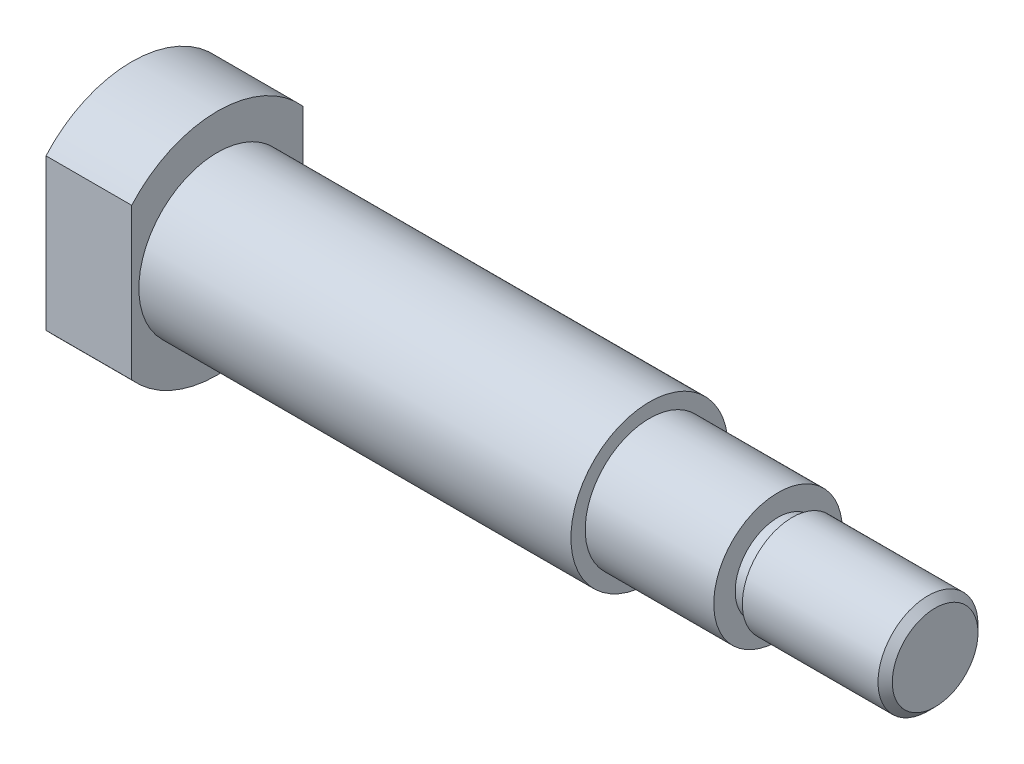
ISO-10303-21;
HEADER;
FILE_DESCRIPTION(('STEP AP214'),'2;1');
FILE_NAME('part.step','',(''),(''),'','','');
FILE_SCHEMA(('AUTOMOTIVE_DESIGN { 1 0 10303 214 1 1 1 1 }'));
ENDSEC;
DATA;
#1=APPLICATION_CONTEXT('core data for automotive mechanical design processes');
#2=APPLICATION_PROTOCOL_DEFINITION('international standard','automotive_design',2000,#1);
#3=PRODUCT_CONTEXT('',#1,'mechanical');
#4=PRODUCT('Part','Part','',(#3));
#5=PRODUCT_RELATED_PRODUCT_CATEGORY('part','',(#4));
#6=PRODUCT_DEFINITION_FORMATION('','',#4);
#7=PRODUCT_DEFINITION_CONTEXT('part definition',#1,'design');
#8=PRODUCT_DEFINITION('design','',#6,#7);
#9=PRODUCT_DEFINITION_SHAPE('','',#8);
#10=(LENGTH_UNIT() NAMED_UNIT(*) SI_UNIT(.MILLI.,.METRE.));
#11=(NAMED_UNIT(*) PLANE_ANGLE_UNIT() SI_UNIT($,.RADIAN.));
#12=(NAMED_UNIT(*) SI_UNIT($,.STERADIAN.) SOLID_ANGLE_UNIT());
#13=UNCERTAINTY_MEASURE_WITH_UNIT(LENGTH_MEASURE(1.E-05),#10,'distance_accuracy_value','');
#14=(GEOMETRIC_REPRESENTATION_CONTEXT(3) GLOBAL_UNCERTAINTY_ASSIGNED_CONTEXT((#13)) GLOBAL_UNIT_ASSIGNED_CONTEXT((#10,
#11,#12)) REPRESENTATION_CONTEXT('',''));
#15=CARTESIAN_POINT('',(0.,0.,0.));
#16=DIRECTION('',(0.,0.,1.));
#17=DIRECTION('',(1.,0.,0.));
#18=AXIS2_PLACEMENT_3D('',#15,#16,#17);
#19=CARTESIAN_POINT('',(57.,0.,0.));
#20=DIRECTION('',(1.,0.,0.));
#21=DIRECTION('',(0.,0.,-1.));
#22=AXIS2_PLACEMENT_3D('',#19,#20,#21);
#23=CYLINDRICAL_SURFACE('',#22,16.);
#24=DIRECTION('',(-1.,0.,0.));
#25=VECTOR('',#24,1.);
#26=CARTESIAN_POINT('',(-43.5,-10.5830052442584,-12.));
#27=LINE('',#26,#25);
#28=CARTESIAN_POINT('',(-43.5,-10.5830052442584,-12.));
#29=VERTEX_POINT('',#28);
#30=CARTESIAN_POINT('',(-55.5,-10.5830052442584,-12.));
#31=VERTEX_POINT('',#30);
#32=EDGE_CURVE('E51',#29,#31,#27,.T.);
#33=ORIENTED_EDGE('',*,*,#32,.F.);
#34=CARTESIAN_POINT('',(-43.5,0.,0.));
#35=DIRECTION('',(1.,0.,0.));
#36=DIRECTION('',(0.,0.,-1.));
#37=AXIS2_PLACEMENT_3D('',#34,#35,#36);
#38=CIRCLE('',#37,16.);
#39=CARTESIAN_POINT('',(-43.5,-10.5830052442584,12.));
#40=VERTEX_POINT('',#39);
#41=EDGE_CURVE('E132',#40,#29,#38,.T.);
#42=ORIENTED_EDGE('',*,*,#41,.F.);
#43=DIRECTION('',(-1.,0.,0.));
#44=VECTOR('',#43,1.);
#45=CARTESIAN_POINT('',(-43.5,-10.5830052442584,12.));
#46=LINE('',#45,#44);
#47=CARTESIAN_POINT('',(-55.5,-10.5830052442584,12.));
#48=VERTEX_POINT('',#47);
#49=EDGE_CURVE('E109',#40,#48,#46,.T.);
#50=ORIENTED_EDGE('',*,*,#49,.T.);
#51=CARTESIAN_POINT('',(-55.5,0.,0.));
#52=DIRECTION('',(1.,0.,0.));
#53=DIRECTION('',(0.,0.,-1.));
#54=AXIS2_PLACEMENT_3D('',#51,#52,#53);
#55=CIRCLE('',#54,16.);
#56=EDGE_CURVE('E128',#48,#31,#55,.T.);
#57=ORIENTED_EDGE('',*,*,#56,.T.);
#58=EDGE_LOOP('',(#33,#42,#50,#57));
#59=FACE_BOUND('',#58,.T.);
#60=ADVANCED_FACE('F36',(#59),#23,.T.);
#61=CARTESIAN_POINT('',(17.,11.,0.));
#62=DIRECTION('',(1.,0.,0.));
#63=DIRECTION('',(0.,0.,-1.));
#64=AXIS2_PLACEMENT_3D('',#61,#62,#63);
#65=PLANE('',#64);
#66=CARTESIAN_POINT('',(17.,0.,0.));
#67=DIRECTION('',(1.,0.,0.));
#68=DIRECTION('',(0.,0.,-1.));
#69=AXIS2_PLACEMENT_3D('',#66,#67,#68);
#70=CIRCLE('',#69,11.);
#71=CARTESIAN_POINT('',(17.,0.,-11.));
#72=VERTEX_POINT('',#71);
#73=EDGE_CURVE('E138',#72,#72,#70,.T.);
#74=ORIENTED_EDGE('',*,*,#73,.T.);
#75=EDGE_LOOP('',(#74));
#76=FACE_BOUND('',#75,.T.);
#77=CARTESIAN_POINT('',(17.,0.,0.));
#78=DIRECTION('',(1.,0.,0.));
#79=DIRECTION('',(0.,0.,-1.));
#80=AXIS2_PLACEMENT_3D('',#77,#78,#79);
#81=CIRCLE('',#80,9.);
#82=CARTESIAN_POINT('',(17.,0.,-9.));
#83=VERTEX_POINT('',#82);
#84=EDGE_CURVE('E112',#83,#83,#81,.T.);
#85=ORIENTED_EDGE('',*,*,#84,.F.);
#86=EDGE_LOOP('',(#85));
#87=FACE_BOUND('',#86,.T.);
#88=ADVANCED_FACE('F160',(#76,#87),#65,.T.);
#89=CARTESIAN_POINT('',(57.,0.,0.));
#90=DIRECTION('',(1.,0.,0.));
#91=DIRECTION('',(0.,0.,-1.));
#92=AXIS2_PLACEMENT_3D('',#89,#90,#91);
#93=CYLINDRICAL_SURFACE('',#92,11.);
#94=CARTESIAN_POINT('',(-43.5,0.,0.));
#95=DIRECTION('',(1.,0.,0.));
#96=DIRECTION('',(0.,0.,-1.));
#97=AXIS2_PLACEMENT_3D('',#94,#95,#96);
#98=CIRCLE('',#97,11.);
#99=CARTESIAN_POINT('',(-43.5,0.,-11.));
#100=VERTEX_POINT('',#99);
#101=EDGE_CURVE('E135',#100,#100,#98,.T.);
#102=ORIENTED_EDGE('',*,*,#101,.T.);
#103=EDGE_LOOP('',(#102));
#104=FACE_BOUND('',#103,.T.);
#105=ORIENTED_EDGE('',*,*,#73,.F.);
#106=EDGE_LOOP('',(#105));
#107=FACE_BOUND('',#106,.T.);
#108=ADVANCED_FACE('F167',(#104,#107),#93,.T.);
#109=CARTESIAN_POINT('',(-43.5,11.,0.));
#110=DIRECTION('',(1.,0.,0.));
#111=DIRECTION('',(0.,0.,-1.));
#112=AXIS2_PLACEMENT_3D('',#109,#110,#111);
#113=PLANE('',#112);
#114=DIRECTION('',(0.,1.,0.));
#115=VECTOR('',#114,1.);
#116=CARTESIAN_POINT('',(-43.5,10.5830052442584,-12.));
#117=LINE('',#116,#115);
#118=CARTESIAN_POINT('',(-43.5,10.5830052442584,-12.));
#119=VERTEX_POINT('',#118);
#120=EDGE_CURVE('E93',#29,#119,#117,.T.);
#121=ORIENTED_EDGE('',*,*,#120,.T.);
#122=CARTESIAN_POINT('',(-43.5,10.5830052442584,12.));
#123=VERTEX_POINT('',#122);
#124=EDGE_CURVE('E131',#119,#123,#38,.T.);
#125=ORIENTED_EDGE('',*,*,#124,.T.);
#126=DIRECTION('',(0.,-1.,0.));
#127=VECTOR('',#126,1.);
#128=CARTESIAN_POINT('',(-43.5,10.5830052442584,12.));
#129=LINE('',#128,#127);
#130=EDGE_CURVE('E104',#123,#40,#129,.T.);
#131=ORIENTED_EDGE('',*,*,#130,.T.);
#132=ORIENTED_EDGE('',*,*,#41,.T.);
#133=EDGE_LOOP('',(#121,#125,#131,#132));
#134=FACE_BOUND('',#133,.T.);
#135=ORIENTED_EDGE('',*,*,#101,.F.);
#136=EDGE_LOOP('',(#135));
#137=FACE_BOUND('',#136,.T.);
#138=ADVANCED_FACE('F173',(#134,#137),#113,.T.);
#139=DIRECTION('',(-1.,0.,0.));
#140=VECTOR('',#139,1.);
#141=CARTESIAN_POINT('',(-43.5,10.5830052442584,-12.));
#142=LINE('',#141,#140);
#143=CARTESIAN_POINT('',(-55.5,10.5830052442584,-12.));
#144=VERTEX_POINT('',#143);
#145=EDGE_CURVE('E100',#119,#144,#142,.T.);
#146=ORIENTED_EDGE('',*,*,#145,.T.);
#147=CARTESIAN_POINT('',(-55.5,10.5830052442584,12.));
#148=VERTEX_POINT('',#147);
#149=EDGE_CURVE('E59',#144,#148,#55,.T.);
#150=ORIENTED_EDGE('',*,*,#149,.T.);
#151=DIRECTION('',(-1.,0.,0.));
#152=VECTOR('',#151,1.);
#153=CARTESIAN_POINT('',(-43.5,10.5830052442584,12.));
#154=LINE('',#153,#152);
#155=EDGE_CURVE('E107',#123,#148,#154,.T.);
#156=ORIENTED_EDGE('',*,*,#155,.F.);
#157=ORIENTED_EDGE('',*,*,#124,.F.);
#158=EDGE_LOOP('',(#146,#150,#156,#157));
#159=FACE_BOUND('',#158,.T.);
#160=ADVANCED_FACE('F163',(#159),#23,.T.);
#161=CARTESIAN_POINT('',(-55.5,16.,0.));
#162=DIRECTION('',(-1.,0.,0.));
#163=DIRECTION('',(0.,0.,1.));
#164=AXIS2_PLACEMENT_3D('',#161,#162,#163);
#165=PLANE('',#164);
#166=CARTESIAN_POINT('',(-55.5,0.,0.));
#167=DIRECTION('',(-1.,0.,0.));
#168=DIRECTION('',(0.,0.,1.));
#169=AXIS2_PLACEMENT_3D('',#166,#167,#168);
#170=CIRCLE('',#169,2.09999999999999);
#171=CARTESIAN_POINT('',(-55.5,0.,2.09999999999999));
#172=VERTEX_POINT('',#171);
#173=EDGE_CURVE('E91',#172,#172,#170,.T.);
#174=ORIENTED_EDGE('',*,*,#173,.F.);
#175=EDGE_LOOP('',(#174));
#176=FACE_BOUND('',#175,.T.);
#177=DIRECTION('',(0.,1.,0.));
#178=VECTOR('',#177,1.);
#179=CARTESIAN_POINT('',(-55.5,10.5830052442584,-12.));
#180=LINE('',#179,#178);
#181=EDGE_CURVE('E90',#31,#144,#180,.T.);
#182=ORIENTED_EDGE('',*,*,#181,.F.);
#183=ORIENTED_EDGE('',*,*,#56,.F.);
#184=DIRECTION('',(0.,-1.,0.));
#185=VECTOR('',#184,1.);
#186=CARTESIAN_POINT('',(-55.5,10.5830052442584,12.));
#187=LINE('',#186,#185);
#188=EDGE_CURVE('E102',#148,#48,#187,.T.);
#189=ORIENTED_EDGE('',*,*,#188,.F.);
#190=ORIENTED_EDGE('',*,*,#149,.F.);
#191=EDGE_LOOP('',(#182,#183,#189,#190));
#192=FACE_BOUND('',#191,.T.);
#193=ADVANCED_FACE('F172',(#176,#192),#165,.T.);
#194=CARTESIAN_POINT('',(57.,7.,0.));
#195=DIRECTION('',(1.,0.,0.));
#196=DIRECTION('',(0.,0.,-1.));
#197=AXIS2_PLACEMENT_3D('',#194,#195,#196);
#198=PLANE('',#197);
#199=CARTESIAN_POINT('',(57.,0.,0.));
#200=DIRECTION('',(1.,0.,0.));
#201=DIRECTION('',(0.,0.,-1.));
#202=AXIS2_PLACEMENT_3D('',#199,#200,#201);
#203=CIRCLE('',#202,6.);
#204=CARTESIAN_POINT('',(57.,0.,-6.));
#205=VERTEX_POINT('',#204);
#206=EDGE_CURVE('E44',#205,#205,#203,.T.);
#207=ORIENTED_EDGE('',*,*,#206,.T.);
#208=EDGE_LOOP('',(#207));
#209=FACE_BOUND('',#208,.T.);
#210=ADVANCED_FACE('F143',(#209),#198,.T.);
#211=CARTESIAN_POINT('',(57.,0.,0.));
#212=DIRECTION('',(1.,0.,0.));
#213=DIRECTION('',(0.,0.,-1.));
#214=AXIS2_PLACEMENT_3D('',#211,#212,#213);
#215=CYLINDRICAL_SURFACE('',#214,7.);
#216=CARTESIAN_POINT('',(56.,0.,0.));
#217=DIRECTION('',(1.,0.,0.));
#218=DIRECTION('',(0.,0.,-1.));
#219=AXIS2_PLACEMENT_3D('',#216,#217,#218);
#220=CIRCLE('',#219,7.);
#221=CARTESIAN_POINT('',(56.,0.,-7.));
#222=VERTEX_POINT('',#221);
#223=EDGE_CURVE('E11',#222,#222,#220,.F.);
#224=ORIENTED_EDGE('',*,*,#223,.T.);
#225=EDGE_LOOP('',(#224));
#226=FACE_BOUND('',#225,.T.);
#227=CARTESIAN_POINT('',(37.,0.,0.));
#228=DIRECTION('',(1.,0.,0.));
#229=DIRECTION('',(0.,0.,-1.));
#230=AXIS2_PLACEMENT_3D('',#227,#228,#229);
#231=CIRCLE('',#230,7.);
#232=CARTESIAN_POINT('',(37.,0.,-7.));
#233=VERTEX_POINT('',#232);
#234=EDGE_CURVE('E125',#233,#233,#231,.T.);
#235=ORIENTED_EDGE('',*,*,#234,.T.);
#236=EDGE_LOOP('',(#235));
#237=FACE_BOUND('',#236,.T.);
#238=ADVANCED_FACE('F203',(#226,#237),#215,.T.);
#239=CARTESIAN_POINT('',(37.,6.,0.));
#240=DIRECTION('',(-1.,0.,0.));
#241=DIRECTION('',(0.,0.,1.));
#242=AXIS2_PLACEMENT_3D('',#239,#240,#241);
#243=PLANE('',#242);
#244=CARTESIAN_POINT('',(37.,0.,0.));
#245=DIRECTION('',(1.,0.,0.));
#246=DIRECTION('',(0.,0.,-1.));
#247=AXIS2_PLACEMENT_3D('',#244,#245,#246);
#248=CIRCLE('',#247,6.);
#249=CARTESIAN_POINT('',(37.,0.,-6.));
#250=VERTEX_POINT('',#249);
#251=EDGE_CURVE('E122',#250,#250,#248,.T.);
#252=ORIENTED_EDGE('',*,*,#251,.T.);
#253=EDGE_LOOP('',(#252));
#254=FACE_BOUND('',#253,.T.);
#255=ORIENTED_EDGE('',*,*,#234,.F.);
#256=EDGE_LOOP('',(#255));
#257=FACE_BOUND('',#256,.T.);
#258=ADVANCED_FACE('F199',(#254,#257),#243,.T.);
#259=CARTESIAN_POINT('',(57.,0.,0.));
#260=DIRECTION('',(1.,0.,0.));
#261=DIRECTION('',(0.,0.,-1.));
#262=AXIS2_PLACEMENT_3D('',#259,#260,#261);
#263=CYLINDRICAL_SURFACE('',#262,6.);
#264=CARTESIAN_POINT('',(35.,0.,0.));
#265=DIRECTION('',(1.,0.,0.));
#266=DIRECTION('',(0.,0.,-1.));
#267=AXIS2_PLACEMENT_3D('',#264,#265,#266);
#268=CIRCLE('',#267,6.);
#269=CARTESIAN_POINT('',(35.,0.,-6.));
#270=VERTEX_POINT('',#269);
#271=EDGE_CURVE('E119',#270,#270,#268,.T.);
#272=ORIENTED_EDGE('',*,*,#271,.T.);
#273=EDGE_LOOP('',(#272));
#274=FACE_BOUND('',#273,.T.);
#275=ORIENTED_EDGE('',*,*,#251,.F.);
#276=EDGE_LOOP('',(#275));
#277=FACE_BOUND('',#276,.T.);
#278=ADVANCED_FACE('F195',(#274,#277),#263,.T.);
#279=CARTESIAN_POINT('',(35.,9.,0.));
#280=DIRECTION('',(1.,0.,0.));
#281=DIRECTION('',(0.,0.,-1.));
#282=AXIS2_PLACEMENT_3D('',#279,#280,#281);
#283=PLANE('',#282);
#284=CARTESIAN_POINT('',(35.,0.,0.));
#285=DIRECTION('',(1.,0.,0.));
#286=DIRECTION('',(0.,0.,-1.));
#287=AXIS2_PLACEMENT_3D('',#284,#285,#286);
#288=CIRCLE('',#287,9.);
#289=CARTESIAN_POINT('',(35.,0.,-9.));
#290=VERTEX_POINT('',#289);
#291=EDGE_CURVE('E116',#290,#290,#288,.T.);
#292=ORIENTED_EDGE('',*,*,#291,.T.);
#293=EDGE_LOOP('',(#292));
#294=FACE_BOUND('',#293,.T.);
#295=ORIENTED_EDGE('',*,*,#271,.F.);
#296=EDGE_LOOP('',(#295));
#297=FACE_BOUND('',#296,.T.);
#298=ADVANCED_FACE('F155',(#294,#297),#283,.T.);
#299=CARTESIAN_POINT('',(57.,0.,0.));
#300=DIRECTION('',(1.,0.,0.));
#301=DIRECTION('',(0.,0.,-1.));
#302=AXIS2_PLACEMENT_3D('',#299,#300,#301);
#303=CYLINDRICAL_SURFACE('',#302,9.);
#304=ORIENTED_EDGE('',*,*,#84,.T.);
#305=EDGE_LOOP('',(#304));
#306=FACE_BOUND('',#305,.T.);
#307=ORIENTED_EDGE('',*,*,#291,.F.);
#308=EDGE_LOOP('',(#307));
#309=FACE_BOUND('',#308,.T.);
#310=ADVANCED_FACE('F147',(#306,#309),#303,.T.);
#311=CARTESIAN_POINT('',(57.,0.,0.));
#312=DIRECTION('',(-1.,0.,0.));
#313=DIRECTION('',(0.,0.,1.));
#314=AXIS2_PLACEMENT_3D('',#311,#312,#313);
#315=CONICAL_SURFACE('',#314,6.,0.78539816339745);
#316=ORIENTED_EDGE('',*,*,#223,.F.);
#317=EDGE_LOOP('',(#316));
#318=FACE_BOUND('',#317,.T.);
#319=ORIENTED_EDGE('',*,*,#206,.F.);
#320=EDGE_LOOP('',(#319));
#321=FACE_BOUND('',#320,.T.);
#322=ADVANCED_FACE('F38',(#318,#321),#315,.T.);
#323=CARTESIAN_POINT('',(-43.5,10.5830052442584,12.));
#324=DIRECTION('',(0.,0.,-1.));
#325=DIRECTION('',(-1.,0.,0.));
#326=AXIS2_PLACEMENT_3D('',#323,#324,#325);
#327=PLANE('',#326);
#328=ORIENTED_EDGE('',*,*,#188,.T.);
#329=ORIENTED_EDGE('',*,*,#49,.F.);
#330=ORIENTED_EDGE('',*,*,#130,.F.);
#331=ORIENTED_EDGE('',*,*,#155,.T.);
#332=EDGE_LOOP('',(#328,#329,#330,#331));
#333=FACE_BOUND('',#332,.T.);
#334=ADVANCED_FACE('F146',(#333),#327,.F.);
#335=CARTESIAN_POINT('',(-43.5,10.5830052442584,-12.));
#336=DIRECTION('',(0.,0.,1.));
#337=DIRECTION('',(1.,0.,0.));
#338=AXIS2_PLACEMENT_3D('',#335,#336,#337);
#339=PLANE('',#338);
#340=ORIENTED_EDGE('',*,*,#181,.T.);
#341=ORIENTED_EDGE('',*,*,#145,.F.);
#342=ORIENTED_EDGE('',*,*,#120,.F.);
#343=ORIENTED_EDGE('',*,*,#32,.T.);
#344=EDGE_LOOP('',(#340,#341,#342,#343));
#345=FACE_BOUND('',#344,.T.);
#346=ADVANCED_FACE('F84',(#345),#339,.F.);
#347=CARTESIAN_POINT('',(7.50000000000001,0.,0.));
#348=DIRECTION('',(-1.,0.,0.));
#349=DIRECTION('',(0.,0.,1.));
#350=AXIS2_PLACEMENT_3D('',#347,#348,#349);
#351=CONICAL_SURFACE('',#350,2.09999999999998,1.02974425867665);
#352=CARTESIAN_POINT('',(8.76180729995789,0.,0.));
#353=VERTEX_POINT('',#352);
#354=VERTEX_LOOP('',#353);
#355=FACE_BOUND('',#354,.T.);
#356=CARTESIAN_POINT('',(7.50000000000001,0.,0.));
#357=DIRECTION('',(-1.,0.,0.));
#358=DIRECTION('',(0.,0.,1.));
#359=AXIS2_PLACEMENT_3D('',#356,#357,#358);
#360=CIRCLE('',#359,2.09999999999998);
#361=CARTESIAN_POINT('',(7.50000000000001,0.,2.09999999999998));
#362=VERTEX_POINT('',#361);
#363=EDGE_CURVE('E88',#362,#362,#360,.T.);
#364=ORIENTED_EDGE('',*,*,#363,.T.);
#365=EDGE_LOOP('',(#364));
#366=FACE_BOUND('',#365,.T.);
#367=ADVANCED_FACE('F80',(#355,#366),#351,.F.);
#368=CARTESIAN_POINT('',(-55.5,0.,0.));
#369=DIRECTION('',(-1.,0.,0.));
#370=DIRECTION('',(0.,0.,1.));
#371=AXIS2_PLACEMENT_3D('',#368,#369,#370);
#372=CYLINDRICAL_SURFACE('',#371,2.09999999999999);
#373=ORIENTED_EDGE('',*,*,#363,.F.);
#374=EDGE_LOOP('',(#373));
#375=FACE_BOUND('',#374,.T.);
#376=ORIENTED_EDGE('',*,*,#173,.T.);
#377=EDGE_LOOP('',(#376));
#378=FACE_BOUND('',#377,.T.);
#379=ADVANCED_FACE('F83',(#375,#378),#372,.F.);
#380=CLOSED_SHELL('',(#60,#88,#108,#138,#160,#193,#210,#238,#258,#278,#298,#310,#322,#334,#346,
#367,#379));
#381=MANIFOLD_SOLID_BREP('B2',#380);
#382=ADVANCED_BREP_SHAPE_REPRESENTATION('',(#18,#381),#14);
#383=SHAPE_DEFINITION_REPRESENTATION(#9,#382);
ENDSEC;
END-ISO-10303-21;
